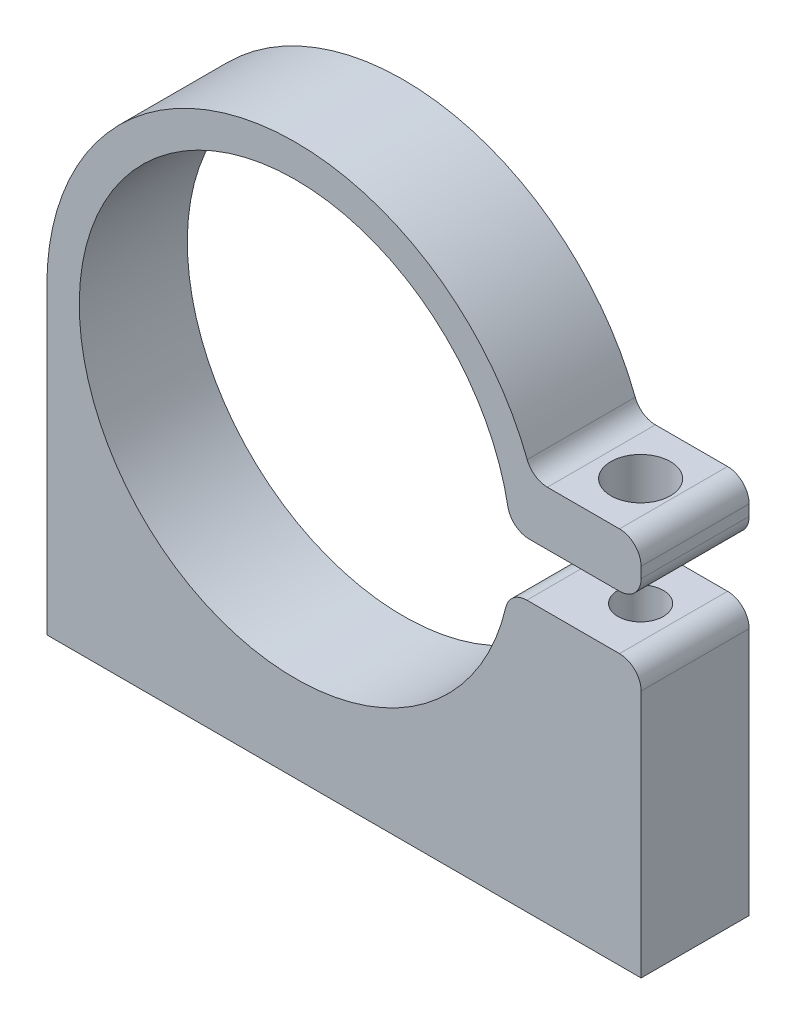
ISO-10303-21;
HEADER;
FILE_DESCRIPTION(('STEP AP214'),'2;1');
FILE_NAME('part.step','',(''),(''),'','','');
FILE_SCHEMA(('AUTOMOTIVE_DESIGN { 1 0 10303 214 1 1 1 1 }'));
ENDSEC;
DATA;
#1=APPLICATION_CONTEXT('core data for automotive mechanical design processes');
#2=APPLICATION_PROTOCOL_DEFINITION('international standard','automotive_design',2000,#1);
#3=PRODUCT_CONTEXT('',#1,'mechanical');
#4=PRODUCT('Part','Part','',(#3));
#5=PRODUCT_RELATED_PRODUCT_CATEGORY('part','',(#4));
#6=PRODUCT_DEFINITION_FORMATION('','',#4);
#7=PRODUCT_DEFINITION_CONTEXT('part definition',#1,'design');
#8=PRODUCT_DEFINITION('design','',#6,#7);
#9=PRODUCT_DEFINITION_SHAPE('','',#8);
#10=(LENGTH_UNIT() NAMED_UNIT(*) SI_UNIT(.MILLI.,.METRE.));
#11=(NAMED_UNIT(*) PLANE_ANGLE_UNIT() SI_UNIT($,.RADIAN.));
#12=(NAMED_UNIT(*) SI_UNIT($,.STERADIAN.) SOLID_ANGLE_UNIT());
#13=UNCERTAINTY_MEASURE_WITH_UNIT(LENGTH_MEASURE(1.E-05),#10,'distance_accuracy_value','');
#14=(GEOMETRIC_REPRESENTATION_CONTEXT(3) GLOBAL_UNCERTAINTY_ASSIGNED_CONTEXT((#13)) GLOBAL_UNIT_ASSIGNED_CONTEXT((#10,
#11,#12)) REPRESENTATION_CONTEXT('',''));
#15=CARTESIAN_POINT('',(0.,0.,0.));
#16=DIRECTION('',(0.,0.,1.));
#17=DIRECTION('',(1.,0.,0.));
#18=AXIS2_PLACEMENT_3D('',#15,#16,#17);
#19=CARTESIAN_POINT('',(32.,7.,10.));
#20=DIRECTION('',(0.,-1.,0.));
#21=DIRECTION('',(1.,0.,0.));
#22=AXIS2_PLACEMENT_3D('',#19,#20,#21);
#23=PLANE('',#22);
#24=DIRECTION('',(-1.,0.,0.));
#25=VECTOR('',#24,1.);
#26=CARTESIAN_POINT('',(32.,7.,10.));
#27=LINE('',#26,#25);
#28=CARTESIAN_POINT('',(30.,7.,10.));
#29=VERTEX_POINT('',#28);
#30=CARTESIAN_POINT('',(23.3238075793812,7.,10.));
#31=VERTEX_POINT('',#30);
#32=EDGE_CURVE('E194',#29,#31,#27,.T.);
#33=ORIENTED_EDGE('',*,*,#32,.F.);
#34=DIRECTION('',(0.,0.,-1.));
#35=VECTOR('',#34,1.);
#36=CARTESIAN_POINT('',(30.,7.,10.));
#37=LINE('',#36,#35);
#38=CARTESIAN_POINT('',(30.,7.,0.));
#39=VERTEX_POINT('',#38);
#40=EDGE_CURVE('E256',#29,#39,#37,.T.);
#41=ORIENTED_EDGE('',*,*,#40,.T.);
#42=DIRECTION('',(-1.,0.,0.));
#43=VECTOR('',#42,1.);
#44=CARTESIAN_POINT('',(32.,7.,0.));
#45=LINE('',#44,#43);
#46=CARTESIAN_POINT('',(23.3238075793812,7.,0.));
#47=VERTEX_POINT('',#46);
#48=EDGE_CURVE('E176',#39,#47,#45,.T.);
#49=ORIENTED_EDGE('',*,*,#48,.T.);
#50=DIRECTION('',(0.,0.,1.));
#51=VECTOR('',#50,1.);
#52=CARTESIAN_POINT('',(23.3238075793812,7.,10.));
#53=LINE('',#52,#51);
#54=EDGE_CURVE('E51',#47,#31,#53,.T.);
#55=ORIENTED_EDGE('',*,*,#54,.T.);
#56=EDGE_LOOP('',(#33,#41,#49,#55));
#57=FACE_BOUND('',#56,.T.);
#58=CARTESIAN_POINT('',(26.9544511501033,7.,5.));
#59=DIRECTION('',(0.,1.,0.));
#60=DIRECTION('',(0.,0.,1.));
#61=AXIS2_PLACEMENT_3D('',#58,#59,#60);
#62=CIRCLE('',#61,2.75);
#63=CARTESIAN_POINT('',(26.9544511501033,7.,7.75));
#64=VERTEX_POINT('',#63);
#65=EDGE_CURVE('E166',#64,#64,#62,.T.);
#66=ORIENTED_EDGE('',*,*,#65,.F.);
#67=EDGE_LOOP('',(#66));
#68=FACE_BOUND('',#67,.T.);
#69=ADVANCED_FACE('F36',(#57,#68),#23,.F.);
#70=CARTESIAN_POINT('',(0.,0.,10.));
#71=DIRECTION('',(0.,0.,-1.));
#72=DIRECTION('',(-1.,0.,0.));
#73=AXIS2_PLACEMENT_3D('',#70,#71,#72);
#74=CYLINDRICAL_SURFACE('',#73,23.);
#75=CARTESIAN_POINT('',(0.,0.,10.));
#76=DIRECTION('',(0.,0.,1.));
#77=DIRECTION('',(1.,0.,0.));
#78=AXIS2_PLACEMENT_3D('',#75,#76,#77);
#79=CIRCLE('',#78,23.);
#80=CARTESIAN_POINT('',(21.4579029730307,8.28,10.));
#81=VERTEX_POINT('',#80);
#82=CARTESIAN_POINT('',(-23.,0.,10.));
#83=VERTEX_POINT('',#82);
#84=EDGE_CURVE('E173',#81,#83,#79,.T.);
#85=ORIENTED_EDGE('',*,*,#84,.F.);
#86=DIRECTION('',(0.,0.,-1.));
#87=VECTOR('',#86,1.);
#88=CARTESIAN_POINT('',(21.4579029730307,8.28,10.));
#89=LINE('',#88,#87);
#90=CARTESIAN_POINT('',(21.4579029730307,8.28,0.));
#91=VERTEX_POINT('',#90);
#92=EDGE_CURVE('E271',#81,#91,#89,.T.);
#93=ORIENTED_EDGE('',*,*,#92,.T.);
#94=CARTESIAN_POINT('',(0.,0.,0.));
#95=DIRECTION('',(0.,0.,1.));
#96=DIRECTION('',(1.,0.,0.));
#97=AXIS2_PLACEMENT_3D('',#94,#95,#96);
#98=CIRCLE('',#97,23.);
#99=CARTESIAN_POINT('',(-23.,0.,0.));
#100=VERTEX_POINT('',#99);
#101=EDGE_CURVE('E172',#91,#100,#98,.T.);
#102=ORIENTED_EDGE('',*,*,#101,.T.);
#103=DIRECTION('',(0.,0.,-1.));
#104=VECTOR('',#103,1.);
#105=CARTESIAN_POINT('',(-23.,0.,10.));
#106=LINE('',#105,#104);
#107=EDGE_CURVE('E223',#83,#100,#106,.T.);
#108=ORIENTED_EDGE('',*,*,#107,.F.);
#109=EDGE_LOOP('',(#85,#93,#102,#108));
#110=FACE_BOUND('',#109,.T.);
#111=ADVANCED_FACE('F289',(#110),#74,.T.);
#112=CARTESIAN_POINT('',(-23.,0.,10.));
#113=DIRECTION('',(1.,0.,0.));
#114=DIRECTION('',(0.,1.,0.));
#115=AXIS2_PLACEMENT_3D('',#112,#113,#114);
#116=PLANE('',#115);
#117=DIRECTION('',(0.,-1.,0.));
#118=VECTOR('',#117,1.);
#119=CARTESIAN_POINT('',(-23.,0.,0.));
#120=LINE('',#119,#118);
#121=CARTESIAN_POINT('',(-23.,-28.,0.));
#122=VERTEX_POINT('',#121);
#123=EDGE_CURVE('E198',#100,#122,#120,.T.);
#124=ORIENTED_EDGE('',*,*,#123,.T.);
#125=DIRECTION('',(0.,0.,-1.));
#126=VECTOR('',#125,1.);
#127=CARTESIAN_POINT('',(-23.,-28.,10.));
#128=LINE('',#127,#126);
#129=CARTESIAN_POINT('',(-23.,-28.,10.));
#130=VERTEX_POINT('',#129);
#131=EDGE_CURVE('E220',#130,#122,#128,.T.);
#132=ORIENTED_EDGE('',*,*,#131,.F.);
#133=DIRECTION('',(0.,-1.,0.));
#134=VECTOR('',#133,1.);
#135=CARTESIAN_POINT('',(-23.,0.,10.));
#136=LINE('',#135,#134);
#137=EDGE_CURVE('E175',#83,#130,#136,.T.);
#138=ORIENTED_EDGE('',*,*,#137,.F.);
#139=ORIENTED_EDGE('',*,*,#107,.T.);
#140=EDGE_LOOP('',(#124,#132,#138,#139));
#141=FACE_BOUND('',#140,.T.);
#142=ADVANCED_FACE('F291',(#141),#116,.F.);
#143=CARTESIAN_POINT('',(-23.,-28.,10.));
#144=DIRECTION('',(0.,1.,0.));
#145=DIRECTION('',(0.,0.,1.));
#146=AXIS2_PLACEMENT_3D('',#143,#144,#145);
#147=PLANE('',#146);
#148=CARTESIAN_POINT('',(-15.,-28.,5.));
#149=DIRECTION('',(0.,-1.,0.));
#150=DIRECTION('',(0.,0.,-1.));
#151=AXIS2_PLACEMENT_3D('',#148,#149,#150);
#152=CIRCLE('',#151,2.1);
#153=CARTESIAN_POINT('',(-15.,-28.,2.9));
#154=VERTEX_POINT('',#153);
#155=EDGE_CURVE('E156',#154,#154,#152,.T.);
#156=ORIENTED_EDGE('',*,*,#155,.F.);
#157=EDGE_LOOP('',(#156));
#158=FACE_BOUND('',#157,.T.);
#159=CARTESIAN_POINT('',(26.9544511501033,-28.,5.));
#160=DIRECTION('',(0.,1.,0.));
#161=DIRECTION('',(0.,0.,1.));
#162=AXIS2_PLACEMENT_3D('',#159,#160,#161);
#163=CIRCLE('',#162,2.09999999999999);
#164=CARTESIAN_POINT('',(26.9544511501033,-28.,7.1));
#165=VERTEX_POINT('',#164);
#166=EDGE_CURVE('E159',#165,#165,#163,.T.);
#167=ORIENTED_EDGE('',*,*,#166,.T.);
#168=EDGE_LOOP('',(#167));
#169=FACE_BOUND('',#168,.T.);
#170=DIRECTION('',(1.,0.,0.));
#171=VECTOR('',#170,1.);
#172=CARTESIAN_POINT('',(-23.,-28.,0.));
#173=LINE('',#172,#171);
#174=CARTESIAN_POINT('',(32.,-28.,0.));
#175=VERTEX_POINT('',#174);
#176=EDGE_CURVE('E200',#122,#175,#173,.T.);
#177=ORIENTED_EDGE('',*,*,#176,.T.);
#178=DIRECTION('',(0.,0.,-1.));
#179=VECTOR('',#178,1.);
#180=CARTESIAN_POINT('',(32.,-28.,10.));
#181=LINE('',#180,#179);
#182=CARTESIAN_POINT('',(32.,-28.,10.));
#183=VERTEX_POINT('',#182);
#184=EDGE_CURVE('E196',#183,#175,#181,.T.);
#185=ORIENTED_EDGE('',*,*,#184,.F.);
#186=DIRECTION('',(1.,0.,0.));
#187=VECTOR('',#186,1.);
#188=CARTESIAN_POINT('',(-23.,-28.,10.));
#189=LINE('',#188,#187);
#190=EDGE_CURVE('E178',#130,#183,#189,.T.);
#191=ORIENTED_EDGE('',*,*,#190,.F.);
#192=ORIENTED_EDGE('',*,*,#131,.T.);
#193=EDGE_LOOP('',(#177,#185,#191,#192));
#194=FACE_BOUND('',#193,.T.);
#195=ADVANCED_FACE('F298',(#158,#169,#194),#147,.F.);
#196=CARTESIAN_POINT('',(32.,-3.,10.));
#197=DIRECTION('',(-1.,0.,0.));
#198=DIRECTION('',(0.,0.,1.));
#199=AXIS2_PLACEMENT_3D('',#196,#197,#198);
#200=PLANE('',#199);
#201=DIRECTION('',(0.,1.,0.));
#202=VECTOR('',#201,1.);
#203=CARTESIAN_POINT('',(32.,-3.,0.));
#204=LINE('',#203,#202);
#205=CARTESIAN_POINT('',(32.,-5.,0.));
#206=VERTEX_POINT('',#205);
#207=EDGE_CURVE('E202',#175,#206,#204,.T.);
#208=ORIENTED_EDGE('',*,*,#207,.T.);
#209=DIRECTION('',(0.,0.,-1.));
#210=VECTOR('',#209,1.);
#211=CARTESIAN_POINT('',(32.,-5.,10.));
#212=LINE('',#211,#210);
#213=CARTESIAN_POINT('',(32.,-5.,10.));
#214=VERTEX_POINT('',#213);
#215=EDGE_CURVE('E264',#206,#214,#212,.F.);
#216=ORIENTED_EDGE('',*,*,#215,.T.);
#217=DIRECTION('',(0.,1.,0.));
#218=VECTOR('',#217,1.);
#219=CARTESIAN_POINT('',(32.,-3.,10.));
#220=LINE('',#219,#218);
#221=EDGE_CURVE('E180',#183,#214,#220,.T.);
#222=ORIENTED_EDGE('',*,*,#221,.F.);
#223=ORIENTED_EDGE('',*,*,#184,.T.);
#224=EDGE_LOOP('',(#208,#216,#222,#223));
#225=FACE_BOUND('',#224,.T.);
#226=ADVANCED_FACE('F302',(#225),#200,.F.);
#227=CARTESIAN_POINT('',(32.,-3.,10.));
#228=DIRECTION('',(0.,-1.,0.));
#229=DIRECTION('',(1.,0.,0.));
#230=AXIS2_PLACEMENT_3D('',#227,#228,#229);
#231=PLANE('',#230);
#232=CARTESIAN_POINT('',(26.9544511501033,-3.,5.));
#233=DIRECTION('',(0.,1.,0.));
#234=DIRECTION('',(0.,0.,1.));
#235=AXIS2_PLACEMENT_3D('',#232,#233,#234);
#236=CIRCLE('',#235,2.09999999999999);
#237=CARTESIAN_POINT('',(26.9544511501033,-3.,7.09999999999999));
#238=VERTEX_POINT('',#237);
#239=EDGE_CURVE('E155',#238,#238,#236,.T.);
#240=ORIENTED_EDGE('',*,*,#239,.F.);
#241=EDGE_LOOP('',(#240));
#242=FACE_BOUND('',#241,.T.);
#243=DIRECTION('',(-1.,0.,0.));
#244=VECTOR('',#243,1.);
#245=CARTESIAN_POINT('',(32.,-3.,10.));
#246=LINE('',#245,#244);
#247=CARTESIAN_POINT('',(30.,-3.,10.));
#248=VERTEX_POINT('',#247);
#249=CARTESIAN_POINT('',(21.4242852856286,-3.,10.));
#250=VERTEX_POINT('',#249);
#251=EDGE_CURVE('E183',#248,#250,#246,.T.);
#252=ORIENTED_EDGE('',*,*,#251,.F.);
#253=DIRECTION('',(0.,0.,-1.));
#254=VECTOR('',#253,1.);
#255=CARTESIAN_POINT('',(30.,-3.,10.));
#256=LINE('',#255,#254);
#257=CARTESIAN_POINT('',(30.,-3.,0.));
#258=VERTEX_POINT('',#257);
#259=EDGE_CURVE('E261',#248,#258,#256,.T.);
#260=ORIENTED_EDGE('',*,*,#259,.T.);
#261=DIRECTION('',(-1.,0.,0.));
#262=VECTOR('',#261,1.);
#263=CARTESIAN_POINT('',(32.,-3.,0.));
#264=LINE('',#263,#262);
#265=CARTESIAN_POINT('',(21.4242852856286,-3.,0.));
#266=VERTEX_POINT('',#265);
#267=EDGE_CURVE('E205',#258,#266,#264,.T.);
#268=ORIENTED_EDGE('',*,*,#267,.T.);
#269=DIRECTION('',(0.,0.,-1.));
#270=VECTOR('',#269,1.);
#271=CARTESIAN_POINT('',(21.4242852856285,-3.,10.));
#272=LINE('',#271,#270);
#273=EDGE_CURVE('E259',#266,#250,#272,.F.);
#274=ORIENTED_EDGE('',*,*,#273,.T.);
#275=EDGE_LOOP('',(#252,#260,#268,#274));
#276=FACE_BOUND('',#275,.T.);
#277=ADVANCED_FACE('F310',(#242,#276),#231,.F.);
#278=CARTESIAN_POINT('',(0.,0.,10.));
#279=DIRECTION('',(0.,0.,-1.));
#280=DIRECTION('',(-1.,0.,0.));
#281=AXIS2_PLACEMENT_3D('',#278,#279,#280);
#282=CYLINDRICAL_SURFACE('',#281,20.);
#283=CARTESIAN_POINT('',(0.,0.,10.));
#284=DIRECTION('',(0.,0.,-1.));
#285=DIRECTION('',(1.,0.,0.));
#286=AXIS2_PLACEMENT_3D('',#283,#284,#285);
#287=CIRCLE('',#286,20.);
#288=CARTESIAN_POINT('',(19.476622986935,-4.54545454545455,10.));
#289=VERTEX_POINT('',#288);
#290=CARTESIAN_POINT('',(19.6666433207127,3.63636363636364,10.));
#291=VERTEX_POINT('',#290);
#292=EDGE_CURVE('E186',#289,#291,#287,.T.);
#293=ORIENTED_EDGE('',*,*,#292,.F.);
#294=DIRECTION('',(0.,0.,-1.));
#295=VECTOR('',#294,1.);
#296=CARTESIAN_POINT('',(19.476622986935,-4.54545454545455,10.));
#297=LINE('',#296,#295);
#298=CARTESIAN_POINT('',(19.476622986935,-4.54545454545455,0.));
#299=VERTEX_POINT('',#298);
#300=EDGE_CURVE('E268',#289,#299,#297,.T.);
#301=ORIENTED_EDGE('',*,*,#300,.T.);
#302=CARTESIAN_POINT('',(0.,0.,0.));
#303=DIRECTION('',(0.,0.,-1.));
#304=DIRECTION('',(1.,0.,0.));
#305=AXIS2_PLACEMENT_3D('',#302,#303,#304);
#306=CIRCLE('',#305,20.);
#307=CARTESIAN_POINT('',(19.6666433207127,3.63636363636364,0.));
#308=VERTEX_POINT('',#307);
#309=EDGE_CURVE('E208',#299,#308,#306,.T.);
#310=ORIENTED_EDGE('',*,*,#309,.T.);
#311=DIRECTION('',(0.,0.,-1.));
#312=VECTOR('',#311,1.);
#313=CARTESIAN_POINT('',(19.6666433207127,3.63636363636364,10.));
#314=LINE('',#313,#312);
#315=EDGE_CURVE('E266',#308,#291,#314,.F.);
#316=ORIENTED_EDGE('',*,*,#315,.T.);
#317=EDGE_LOOP('',(#293,#301,#310,#316));
#318=FACE_BOUND('',#317,.T.);
#319=ADVANCED_FACE('F319',(#318),#282,.F.);
#320=CARTESIAN_POINT('',(19.8997487421324,2.,10.));
#321=DIRECTION('',(0.,1.,0.));
#322=DIRECTION('',(0.,0.,1.));
#323=AXIS2_PLACEMENT_3D('',#320,#321,#322);
#324=PLANE('',#323);
#325=CARTESIAN_POINT('',(26.9544511501033,2.,5.));
#326=DIRECTION('',(0.,1.,0.));
#327=DIRECTION('',(0.,0.,1.));
#328=AXIS2_PLACEMENT_3D('',#325,#326,#327);
#329=CIRCLE('',#328,2.75);
#330=CARTESIAN_POINT('',(26.9544511501033,2.,7.75));
#331=VERTEX_POINT('',#330);
#332=EDGE_CURVE('E169',#331,#331,#329,.T.);
#333=ORIENTED_EDGE('',*,*,#332,.T.);
#334=EDGE_LOOP('',(#333));
#335=FACE_BOUND('',#334,.T.);
#336=DIRECTION('',(1.,0.,0.));
#337=VECTOR('',#336,1.);
#338=CARTESIAN_POINT('',(19.8997487421324,2.,0.));
#339=LINE('',#338,#337);
#340=CARTESIAN_POINT('',(21.6333076527839,2.,0.));
#341=VERTEX_POINT('',#340);
#342=CARTESIAN_POINT('',(30.,2.,0.));
#343=VERTEX_POINT('',#342);
#344=EDGE_CURVE('E211',#341,#343,#339,.T.);
#345=ORIENTED_EDGE('',*,*,#344,.T.);
#346=DIRECTION('',(0.,0.,-1.));
#347=VECTOR('',#346,1.);
#348=CARTESIAN_POINT('',(30.,2.,10.));
#349=LINE('',#348,#347);
#350=CARTESIAN_POINT('',(30.,2.,10.));
#351=VERTEX_POINT('',#350);
#352=EDGE_CURVE('E244',#343,#351,#349,.F.);
#353=ORIENTED_EDGE('',*,*,#352,.T.);
#354=DIRECTION('',(1.,0.,0.));
#355=VECTOR('',#354,1.);
#356=CARTESIAN_POINT('',(19.8997487421324,2.,10.));
#357=LINE('',#356,#355);
#358=CARTESIAN_POINT('',(21.6333076527839,2.,10.));
#359=VERTEX_POINT('',#358);
#360=EDGE_CURVE('E189',#359,#351,#357,.T.);
#361=ORIENTED_EDGE('',*,*,#360,.F.);
#362=DIRECTION('',(0.,0.,-1.));
#363=VECTOR('',#362,1.);
#364=CARTESIAN_POINT('',(21.6333076527839,2.,10.));
#365=LINE('',#364,#363);
#366=EDGE_CURVE('E241',#359,#341,#365,.T.);
#367=ORIENTED_EDGE('',*,*,#366,.T.);
#368=EDGE_LOOP('',(#345,#353,#361,#367));
#369=FACE_BOUND('',#368,.T.);
#370=ADVANCED_FACE('F328',(#335,#369),#324,.F.);
#371=CARTESIAN_POINT('',(32.,2.,10.));
#372=DIRECTION('',(-1.,0.,0.));
#373=DIRECTION('',(0.,0.,1.));
#374=AXIS2_PLACEMENT_3D('',#371,#372,#373);
#375=PLANE('',#374);
#376=DIRECTION('',(0.,1.,0.));
#377=VECTOR('',#376,1.);
#378=CARTESIAN_POINT('',(32.,2.,10.));
#379=LINE('',#378,#377);
#380=CARTESIAN_POINT('',(32.,4.,10.));
#381=VERTEX_POINT('',#380);
#382=CARTESIAN_POINT('',(32.,5.,10.));
#383=VERTEX_POINT('',#382);
#384=EDGE_CURVE('E192',#381,#383,#379,.T.);
#385=ORIENTED_EDGE('',*,*,#384,.F.);
#386=DIRECTION('',(0.,0.,-1.));
#387=VECTOR('',#386,1.);
#388=CARTESIAN_POINT('',(32.,4.,10.));
#389=LINE('',#388,#387);
#390=CARTESIAN_POINT('',(32.,4.,0.));
#391=VERTEX_POINT('',#390);
#392=EDGE_CURVE('E228',#381,#391,#389,.T.);
#393=ORIENTED_EDGE('',*,*,#392,.T.);
#394=DIRECTION('',(0.,1.,0.));
#395=VECTOR('',#394,1.);
#396=CARTESIAN_POINT('',(32.,2.,0.));
#397=LINE('',#396,#395);
#398=CARTESIAN_POINT('',(32.,5.,0.));
#399=VERTEX_POINT('',#398);
#400=EDGE_CURVE('E214',#391,#399,#397,.T.);
#401=ORIENTED_EDGE('',*,*,#400,.T.);
#402=DIRECTION('',(0.,0.,-1.));
#403=VECTOR('',#402,1.);
#404=CARTESIAN_POINT('',(32.,5.,10.));
#405=LINE('',#404,#403);
#406=EDGE_CURVE('E226',#399,#383,#405,.F.);
#407=ORIENTED_EDGE('',*,*,#406,.T.);
#408=EDGE_LOOP('',(#385,#393,#401,#407));
#409=FACE_BOUND('',#408,.T.);
#410=ADVANCED_FACE('F336',(#409),#375,.F.);
#411=CARTESIAN_POINT('',(0.,0.,10.));
#412=DIRECTION('',(0.,0.,1.));
#413=DIRECTION('',(1.,0.,0.));
#414=AXIS2_PLACEMENT_3D('',#411,#412,#413);
#415=PLANE('',#414);
#416=ORIENTED_EDGE('',*,*,#360,.T.);
#417=CARTESIAN_POINT('',(30.,4.,10.));
#418=DIRECTION('',(0.,0.,1.));
#419=DIRECTION('',(1.,0.,0.));
#420=AXIS2_PLACEMENT_3D('',#417,#418,#419);
#421=CIRCLE('',#420,2.);
#422=EDGE_CURVE('E253',#351,#381,#421,.T.);
#423=ORIENTED_EDGE('',*,*,#422,.T.);
#424=ORIENTED_EDGE('',*,*,#384,.T.);
#425=CARTESIAN_POINT('',(30.,5.,10.));
#426=DIRECTION('',(0.,0.,1.));
#427=DIRECTION('',(1.,0.,0.));
#428=AXIS2_PLACEMENT_3D('',#425,#426,#427);
#429=CIRCLE('',#428,2.);
#430=EDGE_CURVE('E58',#383,#29,#429,.T.);
#431=ORIENTED_EDGE('',*,*,#430,.T.);
#432=ORIENTED_EDGE('',*,*,#32,.T.);
#433=CARTESIAN_POINT('',(23.3238075793812,9.,10.));
#434=DIRECTION('',(0.,0.,1.));
#435=DIRECTION('',(1.,0.,0.));
#436=AXIS2_PLACEMENT_3D('',#433,#434,#435);
#437=CIRCLE('',#436,2.);
#438=EDGE_CURVE('E11',#31,#81,#437,.F.);
#439=ORIENTED_EDGE('',*,*,#438,.T.);
#440=ORIENTED_EDGE('',*,*,#84,.T.);
#441=ORIENTED_EDGE('',*,*,#137,.T.);
#442=ORIENTED_EDGE('',*,*,#190,.T.);
#443=ORIENTED_EDGE('',*,*,#221,.T.);
#444=CARTESIAN_POINT('',(30.,-5.,10.));
#445=DIRECTION('',(0.,0.,1.));
#446=DIRECTION('',(1.,0.,0.));
#447=AXIS2_PLACEMENT_3D('',#444,#445,#446);
#448=CIRCLE('',#447,2.);
#449=EDGE_CURVE('E250',#214,#248,#448,.T.);
#450=ORIENTED_EDGE('',*,*,#449,.T.);
#451=ORIENTED_EDGE('',*,*,#251,.T.);
#452=CARTESIAN_POINT('',(21.4242852856285,-5.,10.));
#453=DIRECTION('',(0.,0.,1.));
#454=DIRECTION('',(1.,0.,0.));
#455=AXIS2_PLACEMENT_3D('',#452,#453,#454);
#456=CIRCLE('',#455,2.);
#457=EDGE_CURVE('E248',#250,#289,#456,.T.);
#458=ORIENTED_EDGE('',*,*,#457,.T.);
#459=ORIENTED_EDGE('',*,*,#292,.T.);
#460=CARTESIAN_POINT('',(21.6333076527839,4.,10.));
#461=DIRECTION('',(0.,0.,1.));
#462=DIRECTION('',(1.,0.,0.));
#463=AXIS2_PLACEMENT_3D('',#460,#461,#462);
#464=CIRCLE('',#463,2.);
#465=EDGE_CURVE('E246',#291,#359,#464,.T.);
#466=ORIENTED_EDGE('',*,*,#465,.T.);
#467=EDGE_LOOP('',(#416,#423,#424,#431,#432,#439,#440,#441,#442,#443,#450,#451,#458,#459,#466));
#468=FACE_BOUND('',#467,.T.);
#469=ADVANCED_FACE('F285',(#468),#415,.T.);
#470=CARTESIAN_POINT('',(0.,0.,0.));
#471=DIRECTION('',(0.,0.,1.));
#472=DIRECTION('',(1.,0.,0.));
#473=AXIS2_PLACEMENT_3D('',#470,#471,#472);
#474=PLANE('',#473);
#475=ORIENTED_EDGE('',*,*,#400,.F.);
#476=CARTESIAN_POINT('',(30.,4.,0.));
#477=DIRECTION('',(0.,0.,1.));
#478=DIRECTION('',(1.,0.,0.));
#479=AXIS2_PLACEMENT_3D('',#476,#477,#478);
#480=CIRCLE('',#479,2.);
#481=EDGE_CURVE('E239',#391,#343,#480,.F.);
#482=ORIENTED_EDGE('',*,*,#481,.T.);
#483=ORIENTED_EDGE('',*,*,#344,.F.);
#484=CARTESIAN_POINT('',(21.6333076527839,4.,0.));
#485=DIRECTION('',(0.,0.,1.));
#486=DIRECTION('',(1.,0.,0.));
#487=AXIS2_PLACEMENT_3D('',#484,#485,#486);
#488=CIRCLE('',#487,2.);
#489=EDGE_CURVE('E231',#341,#308,#488,.F.);
#490=ORIENTED_EDGE('',*,*,#489,.T.);
#491=ORIENTED_EDGE('',*,*,#309,.F.);
#492=CARTESIAN_POINT('',(21.4242852856285,-5.,0.));
#493=DIRECTION('',(0.,0.,1.));
#494=DIRECTION('',(1.,0.,0.));
#495=AXIS2_PLACEMENT_3D('',#492,#493,#494);
#496=CIRCLE('',#495,2.);
#497=EDGE_CURVE('E233',#299,#266,#496,.F.);
#498=ORIENTED_EDGE('',*,*,#497,.T.);
#499=ORIENTED_EDGE('',*,*,#267,.F.);
#500=CARTESIAN_POINT('',(30.,-5.,0.));
#501=DIRECTION('',(0.,0.,1.));
#502=DIRECTION('',(1.,0.,0.));
#503=AXIS2_PLACEMENT_3D('',#500,#501,#502);
#504=CIRCLE('',#503,2.);
#505=EDGE_CURVE('E235',#258,#206,#504,.F.);
#506=ORIENTED_EDGE('',*,*,#505,.T.);
#507=ORIENTED_EDGE('',*,*,#207,.F.);
#508=ORIENTED_EDGE('',*,*,#176,.F.);
#509=ORIENTED_EDGE('',*,*,#123,.F.);
#510=ORIENTED_EDGE('',*,*,#101,.F.);
#511=CARTESIAN_POINT('',(23.3238075793812,9.,0.));
#512=DIRECTION('',(0.,0.,1.));
#513=DIRECTION('',(1.,0.,0.));
#514=AXIS2_PLACEMENT_3D('',#511,#512,#513);
#515=CIRCLE('',#514,2.);
#516=EDGE_CURVE('E44',#91,#47,#515,.T.);
#517=ORIENTED_EDGE('',*,*,#516,.T.);
#518=ORIENTED_EDGE('',*,*,#48,.F.);
#519=CARTESIAN_POINT('',(30.,5.,0.));
#520=DIRECTION('',(0.,0.,1.));
#521=DIRECTION('',(1.,0.,0.));
#522=AXIS2_PLACEMENT_3D('',#519,#520,#521);
#523=CIRCLE('',#522,2.);
#524=EDGE_CURVE('E237',#39,#399,#523,.F.);
#525=ORIENTED_EDGE('',*,*,#524,.T.);
#526=EDGE_LOOP('',(#475,#482,#483,#490,#491,#498,#499,#506,#507,#508,#509,#510,#517,#518,#525));
#527=FACE_BOUND('',#526,.T.);
#528=ADVANCED_FACE('F277',(#527),#474,.F.);
#529=CARTESIAN_POINT('',(30.,4.,10.));
#530=DIRECTION('',(0.,0.,-1.));
#531=DIRECTION('',(-1.,0.,0.));
#532=AXIS2_PLACEMENT_3D('',#529,#530,#531);
#533=CYLINDRICAL_SURFACE('',#532,2.);
#534=ORIENTED_EDGE('',*,*,#422,.F.);
#535=ORIENTED_EDGE('',*,*,#352,.F.);
#536=ORIENTED_EDGE('',*,*,#481,.F.);
#537=ORIENTED_EDGE('',*,*,#392,.F.);
#538=EDGE_LOOP('',(#534,#535,#536,#537));
#539=FACE_BOUND('',#538,.T.);
#540=ADVANCED_FACE('F332',(#539),#533,.T.);
#541=CARTESIAN_POINT('',(30.,5.,10.));
#542=DIRECTION('',(0.,0.,-1.));
#543=DIRECTION('',(-1.,0.,0.));
#544=AXIS2_PLACEMENT_3D('',#541,#542,#543);
#545=CYLINDRICAL_SURFACE('',#544,2.);
#546=ORIENTED_EDGE('',*,*,#430,.F.);
#547=ORIENTED_EDGE('',*,*,#406,.F.);
#548=ORIENTED_EDGE('',*,*,#524,.F.);
#549=ORIENTED_EDGE('',*,*,#40,.F.);
#550=EDGE_LOOP('',(#546,#547,#548,#549));
#551=FACE_BOUND('',#550,.T.);
#552=ADVANCED_FACE('F339',(#551),#545,.T.);
#553=CARTESIAN_POINT('',(30.,-5.,10.));
#554=DIRECTION('',(0.,0.,-1.));
#555=DIRECTION('',(-1.,0.,0.));
#556=AXIS2_PLACEMENT_3D('',#553,#554,#555);
#557=CYLINDRICAL_SURFACE('',#556,2.);
#558=ORIENTED_EDGE('',*,*,#449,.F.);
#559=ORIENTED_EDGE('',*,*,#215,.F.);
#560=ORIENTED_EDGE('',*,*,#505,.F.);
#561=ORIENTED_EDGE('',*,*,#259,.F.);
#562=EDGE_LOOP('',(#558,#559,#560,#561));
#563=FACE_BOUND('',#562,.T.);
#564=ADVANCED_FACE('F305',(#563),#557,.T.);
#565=CARTESIAN_POINT('',(21.4242852856285,-5.,10.));
#566=DIRECTION('',(0.,0.,-1.));
#567=DIRECTION('',(-1.,0.,0.));
#568=AXIS2_PLACEMENT_3D('',#565,#566,#567);
#569=CYLINDRICAL_SURFACE('',#568,2.);
#570=ORIENTED_EDGE('',*,*,#457,.F.);
#571=ORIENTED_EDGE('',*,*,#273,.F.);
#572=ORIENTED_EDGE('',*,*,#497,.F.);
#573=ORIENTED_EDGE('',*,*,#300,.F.);
#574=EDGE_LOOP('',(#570,#571,#572,#573));
#575=FACE_BOUND('',#574,.T.);
#576=ADVANCED_FACE('F314',(#575),#569,.T.);
#577=CARTESIAN_POINT('',(21.6333076527839,4.,10.));
#578=DIRECTION('',(0.,0.,-1.));
#579=DIRECTION('',(-1.,0.,0.));
#580=AXIS2_PLACEMENT_3D('',#577,#578,#579);
#581=CYLINDRICAL_SURFACE('',#580,2.);
#582=ORIENTED_EDGE('',*,*,#465,.F.);
#583=ORIENTED_EDGE('',*,*,#315,.F.);
#584=ORIENTED_EDGE('',*,*,#489,.F.);
#585=ORIENTED_EDGE('',*,*,#366,.F.);
#586=EDGE_LOOP('',(#582,#583,#584,#585));
#587=FACE_BOUND('',#586,.T.);
#588=ADVANCED_FACE('F323',(#587),#581,.T.);
#589=CARTESIAN_POINT('',(23.3238075793812,9.,10.));
#590=DIRECTION('',(0.,0.,-1.));
#591=DIRECTION('',(-1.,0.,0.));
#592=AXIS2_PLACEMENT_3D('',#589,#590,#591);
#593=CYLINDRICAL_SURFACE('',#592,2.);
#594=ORIENTED_EDGE('',*,*,#438,.F.);
#595=ORIENTED_EDGE('',*,*,#54,.F.);
#596=ORIENTED_EDGE('',*,*,#516,.F.);
#597=ORIENTED_EDGE('',*,*,#92,.F.);
#598=EDGE_LOOP('',(#594,#595,#596,#597));
#599=FACE_BOUND('',#598,.T.);
#600=ADVANCED_FACE('F38',(#599),#593,.F.);
#601=CARTESIAN_POINT('',(26.9544511501033,7.,5.));
#602=DIRECTION('',(0.,1.,0.));
#603=DIRECTION('',(0.,0.,1.));
#604=AXIS2_PLACEMENT_3D('',#601,#602,#603);
#605=CYLINDRICAL_SURFACE('',#604,2.75);
#606=ORIENTED_EDGE('',*,*,#332,.F.);
#607=EDGE_LOOP('',(#606));
#608=FACE_BOUND('',#607,.T.);
#609=ORIENTED_EDGE('',*,*,#65,.T.);
#610=EDGE_LOOP('',(#609));
#611=FACE_BOUND('',#610,.T.);
#612=ADVANCED_FACE('F451',(#608,#611),#605,.F.);
#613=CARTESIAN_POINT('',(26.9544511501033,-3.,5.));
#614=DIRECTION('',(0.,1.,0.));
#615=DIRECTION('',(0.,0.,1.));
#616=AXIS2_PLACEMENT_3D('',#613,#614,#615);
#617=CYLINDRICAL_SURFACE('',#616,2.09999999999999);
#618=ORIENTED_EDGE('',*,*,#166,.F.);
#619=EDGE_LOOP('',(#618));
#620=FACE_BOUND('',#619,.T.);
#621=ORIENTED_EDGE('',*,*,#239,.T.);
#622=EDGE_LOOP('',(#621));
#623=FACE_BOUND('',#622,.T.);
#624=ADVANCED_FACE('F149',(#620,#623),#617,.F.);
#625=CARTESIAN_POINT('',(-15.,-18.,5.));
#626=DIRECTION('',(0.,-1.,0.));
#627=DIRECTION('',(0.,0.,-1.));
#628=AXIS2_PLACEMENT_3D('',#625,#626,#627);
#629=CONICAL_SURFACE('',#628,2.1,1.02974425867665);
#630=CARTESIAN_POINT('',(-15.,-16.7381927000421,5.));
#631=VERTEX_POINT('',#630);
#632=VERTEX_LOOP('',#631);
#633=FACE_BOUND('',#632,.T.);
#634=CARTESIAN_POINT('',(-15.,-18.,5.));
#635=DIRECTION('',(0.,-1.,0.));
#636=DIRECTION('',(0.,0.,-1.));
#637=AXIS2_PLACEMENT_3D('',#634,#635,#636);
#638=CIRCLE('',#637,2.1);
#639=CARTESIAN_POINT('',(-15.,-18.,2.9));
#640=VERTEX_POINT('',#639);
#641=EDGE_CURVE('E153',#640,#640,#638,.T.);
#642=ORIENTED_EDGE('',*,*,#641,.T.);
#643=EDGE_LOOP('',(#642));
#644=FACE_BOUND('',#643,.T.);
#645=ADVANCED_FACE('F145',(#633,#644),#629,.F.);
#646=CARTESIAN_POINT('',(-15.,-28.,5.));
#647=DIRECTION('',(0.,-1.,0.));
#648=DIRECTION('',(0.,0.,-1.));
#649=AXIS2_PLACEMENT_3D('',#646,#647,#648);
#650=CYLINDRICAL_SURFACE('',#649,2.1);
#651=ORIENTED_EDGE('',*,*,#641,.F.);
#652=EDGE_LOOP('',(#651));
#653=FACE_BOUND('',#652,.T.);
#654=ORIENTED_EDGE('',*,*,#155,.T.);
#655=EDGE_LOOP('',(#654));
#656=FACE_BOUND('',#655,.T.);
#657=ADVANCED_FACE('F148',(#653,#656),#650,.F.);
#658=CLOSED_SHELL('',(#69,#111,#142,#195,#226,#277,#319,#370,#410,#469,#528,#540,#552,#564,#576,
#588,#600,#612,#624,#645,#657));
#659=MANIFOLD_SOLID_BREP('B2',#658);
#660=ADVANCED_BREP_SHAPE_REPRESENTATION('',(#18,#659),#14);
#661=SHAPE_DEFINITION_REPRESENTATION(#9,#660);
ENDSEC;
END-ISO-10303-21;
